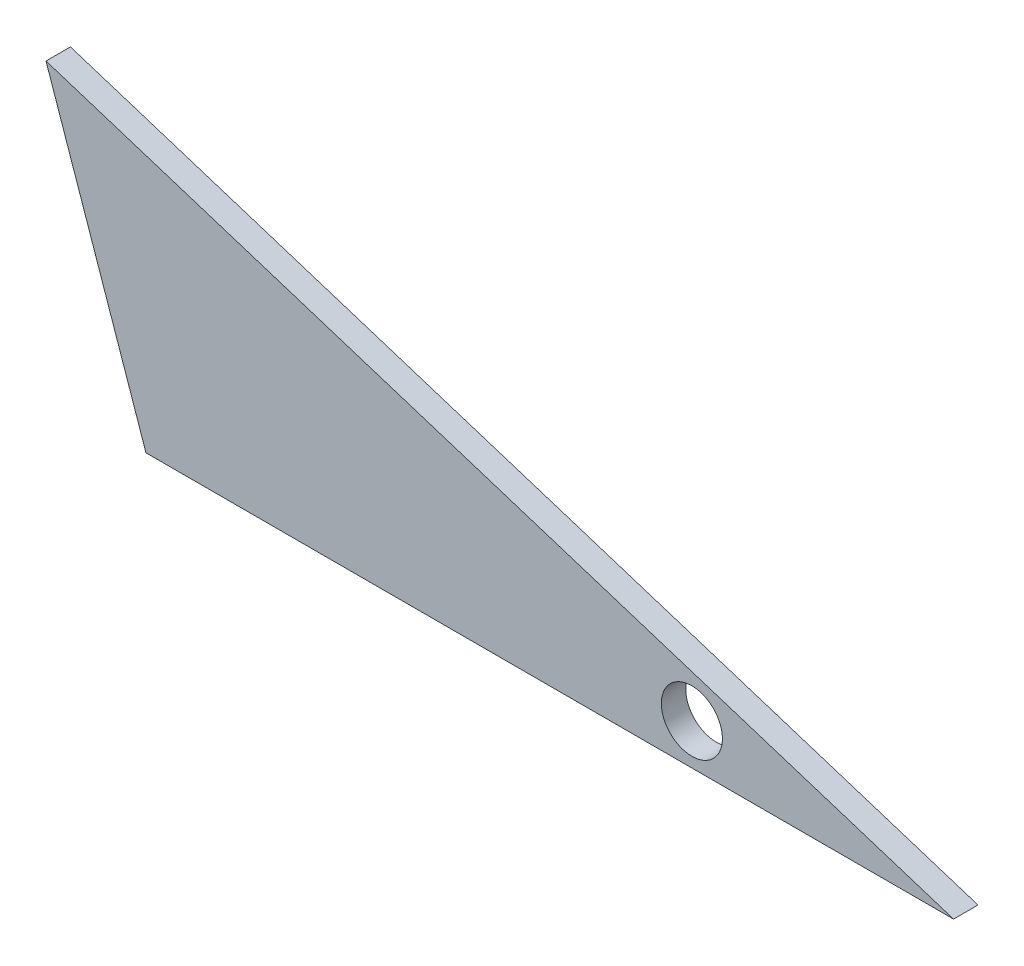
ISO-10303-21;
HEADER;
FILE_DESCRIPTION(('STEP AP214'),'2;1');
FILE_NAME('part.step','',(''),(''),'','','');
FILE_SCHEMA(('AUTOMOTIVE_DESIGN { 1 0 10303 214 1 1 1 1 }'));
ENDSEC;
DATA;
#1=APPLICATION_CONTEXT('core data for automotive mechanical design processes');
#2=APPLICATION_PROTOCOL_DEFINITION('international standard','automotive_design',2000,#1);
#3=PRODUCT_CONTEXT('',#1,'mechanical');
#4=PRODUCT('Part','Part','',(#3));
#5=PRODUCT_RELATED_PRODUCT_CATEGORY('part','',(#4));
#6=PRODUCT_DEFINITION_FORMATION('','',#4);
#7=PRODUCT_DEFINITION_CONTEXT('part definition',#1,'design');
#8=PRODUCT_DEFINITION('design','',#6,#7);
#9=PRODUCT_DEFINITION_SHAPE('','',#8);
#10=(LENGTH_UNIT() NAMED_UNIT(*) SI_UNIT(.MILLI.,.METRE.));
#11=(NAMED_UNIT(*) PLANE_ANGLE_UNIT() SI_UNIT($,.RADIAN.));
#12=(NAMED_UNIT(*) SI_UNIT($,.STERADIAN.) SOLID_ANGLE_UNIT());
#13=UNCERTAINTY_MEASURE_WITH_UNIT(LENGTH_MEASURE(1.E-05),#10,'distance_accuracy_value','');
#14=(GEOMETRIC_REPRESENTATION_CONTEXT(3) GLOBAL_UNCERTAINTY_ASSIGNED_CONTEXT((#13)) GLOBAL_UNIT_ASSIGNED_CONTEXT((#10,
#11,#12)) REPRESENTATION_CONTEXT('',''));
#15=CARTESIAN_POINT('',(0.,0.,0.));
#16=DIRECTION('',(0.,0.,1.));
#17=DIRECTION('',(1.,0.,0.));
#18=AXIS2_PLACEMENT_3D('',#15,#16,#17);
#19=CARTESIAN_POINT('',(0.,0.,3.81));
#20=DIRECTION('',(0.,0.,-1.));
#21=DIRECTION('',(-1.,0.,0.));
#22=AXIS2_PLACEMENT_3D('',#19,#20,#21);
#23=PLANE('',#22);
#24=DIRECTION('',(1.,0.,0.));
#25=VECTOR('',#24,1.);
#26=CARTESIAN_POINT('',(125.964112688173,0.,3.81));
#27=LINE('',#26,#25);
#28=CARTESIAN_POINT('',(0.,0.,3.81));
#29=VERTEX_POINT('',#28);
#30=CARTESIAN_POINT('',(125.964112688173,0.,3.81));
#31=VERTEX_POINT('',#30);
#32=EDGE_CURVE('E73',#29,#31,#27,.T.);
#33=ORIENTED_EDGE('',*,*,#32,.T.);
#34=DIRECTION('',(-0.952744871636842,0.303771640496111,0.));
#35=VECTOR('',#34,1.);
#36=CARTESIAN_POINT('',(-15.5938033701381,45.1340979798364,3.81));
#37=LINE('',#36,#35);
#38=CARTESIAN_POINT('',(-15.5938033701381,45.1340979798364,3.81));
#39=VERTEX_POINT('',#38);
#40=EDGE_CURVE('E69',#31,#39,#37,.T.);
#41=ORIENTED_EDGE('',*,*,#40,.T.);
#42=DIRECTION('',(0.326558120500464,-0.945177123049011,0.));
#43=VECTOR('',#42,1.);
#44=CARTESIAN_POINT('',(0.,0.,3.81));
#45=LINE('',#44,#43);
#46=EDGE_CURVE('E49',#39,#29,#45,.T.);
#47=ORIENTED_EDGE('',*,*,#46,.T.);
#48=EDGE_LOOP('',(#33,#41,#47));
#49=FACE_BOUND('',#48,.T.);
#50=CARTESIAN_POINT('',(85.1442062787306,6.34999999999999,3.81));
#51=DIRECTION('',(0.,0.,1.));
#52=DIRECTION('',(1.,0.,0.));
#53=AXIS2_PLACEMENT_3D('',#50,#51,#52);
#54=CIRCLE('',#53,4.7625);
#55=CARTESIAN_POINT('',(80.3817062787305,6.34999999999999,3.81));
#56=VERTEX_POINT('',#55);
#57=EDGE_CURVE('E83',#56,#56,#54,.T.);
#58=ORIENTED_EDGE('',*,*,#57,.F.);
#59=EDGE_LOOP('',(#58));
#60=FACE_BOUND('',#59,.T.);
#61=ADVANCED_FACE('F32',(#49,#60),#23,.F.);
#62=CARTESIAN_POINT('',(0.,0.,0.));
#63=DIRECTION('',(0.,0.,-1.));
#64=DIRECTION('',(-1.,0.,0.));
#65=AXIS2_PLACEMENT_3D('',#62,#63,#64);
#66=PLANE('',#65);
#67=DIRECTION('',(1.,0.,0.));
#68=VECTOR('',#67,1.);
#69=CARTESIAN_POINT('',(125.964112688173,0.,0.));
#70=LINE('',#69,#68);
#71=CARTESIAN_POINT('',(0.,0.,0.));
#72=VERTEX_POINT('',#71);
#73=CARTESIAN_POINT('',(125.964112688173,0.,0.));
#74=VERTEX_POINT('',#73);
#75=EDGE_CURVE('E80',#72,#74,#70,.T.);
#76=ORIENTED_EDGE('',*,*,#75,.F.);
#77=DIRECTION('',(0.326558120500464,-0.945177123049011,0.));
#78=VECTOR('',#77,1.);
#79=CARTESIAN_POINT('',(0.,0.,0.));
#80=LINE('',#79,#78);
#81=CARTESIAN_POINT('',(-15.5938033701381,45.1340979798364,0.));
#82=VERTEX_POINT('',#81);
#83=EDGE_CURVE('E66',#82,#72,#80,.T.);
#84=ORIENTED_EDGE('',*,*,#83,.F.);
#85=DIRECTION('',(-0.952744871636842,0.303771640496111,0.));
#86=VECTOR('',#85,1.);
#87=CARTESIAN_POINT('',(-15.5938033701381,45.1340979798364,0.));
#88=LINE('',#87,#86);
#89=EDGE_CURVE('E61',#74,#82,#88,.T.);
#90=ORIENTED_EDGE('',*,*,#89,.F.);
#91=EDGE_LOOP('',(#76,#84,#90));
#92=FACE_BOUND('',#91,.T.);
#93=CARTESIAN_POINT('',(85.1442062787306,6.34999999999999,0.));
#94=DIRECTION('',(0.,0.,1.));
#95=DIRECTION('',(1.,0.,0.));
#96=AXIS2_PLACEMENT_3D('',#93,#94,#95);
#97=CIRCLE('',#96,4.7625);
#98=CARTESIAN_POINT('',(80.3817062787305,6.34999999999999,0.));
#99=VERTEX_POINT('',#98);
#100=EDGE_CURVE('E87',#99,#99,#97,.T.);
#101=ORIENTED_EDGE('',*,*,#100,.T.);
#102=EDGE_LOOP('',(#101));
#103=FACE_BOUND('',#102,.T.);
#104=ADVANCED_FACE('F93',(#92,#103),#66,.T.);
#105=CARTESIAN_POINT('',(125.964112688173,0.,3.81));
#106=DIRECTION('',(0.,1.,0.));
#107=DIRECTION('',(-1.,0.,0.));
#108=AXIS2_PLACEMENT_3D('',#105,#106,#107);
#109=PLANE('',#108);
#110=ORIENTED_EDGE('',*,*,#75,.T.);
#111=DIRECTION('',(0.,0.,-1.));
#112=VECTOR('',#111,1.);
#113=CARTESIAN_POINT('',(125.964112688173,0.,3.81));
#114=LINE('',#113,#112);
#115=EDGE_CURVE('E11',#31,#74,#114,.T.);
#116=ORIENTED_EDGE('',*,*,#115,.F.);
#117=ORIENTED_EDGE('',*,*,#32,.F.);
#118=DIRECTION('',(0.,0.,-1.));
#119=VECTOR('',#118,1.);
#120=CARTESIAN_POINT('',(0.,0.,3.81));
#121=LINE('',#120,#119);
#122=EDGE_CURVE('E81',#29,#72,#121,.T.);
#123=ORIENTED_EDGE('',*,*,#122,.T.);
#124=EDGE_LOOP('',(#110,#116,#117,#123));
#125=FACE_BOUND('',#124,.T.);
#126=ADVANCED_FACE('F34',(#125),#109,.F.);
#127=CARTESIAN_POINT('',(-15.5938033701381,45.1340979798364,3.81));
#128=DIRECTION('',(-0.303771640496111,-0.952744871636842,0.));
#129=DIRECTION('',(0.952744871636842,-0.303771640496111,0.));
#130=AXIS2_PLACEMENT_3D('',#127,#128,#129);
#131=PLANE('',#130);
#132=ORIENTED_EDGE('',*,*,#89,.T.);
#133=DIRECTION('',(0.,0.,-1.));
#134=VECTOR('',#133,1.);
#135=CARTESIAN_POINT('',(-15.5938033701381,45.1340979798364,3.81));
#136=LINE('',#135,#134);
#137=EDGE_CURVE('E41',#39,#82,#136,.T.);
#138=ORIENTED_EDGE('',*,*,#137,.F.);
#139=ORIENTED_EDGE('',*,*,#40,.F.);
#140=ORIENTED_EDGE('',*,*,#115,.T.);
#141=EDGE_LOOP('',(#132,#138,#139,#140));
#142=FACE_BOUND('',#141,.T.);
#143=ADVANCED_FACE('F70',(#142),#131,.F.);
#144=CARTESIAN_POINT('',(0.,0.,3.81));
#145=DIRECTION('',(0.945177123049011,0.326558120500464,0.));
#146=DIRECTION('',(-0.326558120500464,0.945177123049011,0.));
#147=AXIS2_PLACEMENT_3D('',#144,#145,#146);
#148=PLANE('',#147);
#149=ORIENTED_EDGE('',*,*,#83,.T.);
#150=ORIENTED_EDGE('',*,*,#122,.F.);
#151=ORIENTED_EDGE('',*,*,#46,.F.);
#152=ORIENTED_EDGE('',*,*,#137,.T.);
#153=EDGE_LOOP('',(#149,#150,#151,#152));
#154=FACE_BOUND('',#153,.T.);
#155=ADVANCED_FACE('F92',(#154),#148,.F.);
#156=CARTESIAN_POINT('',(85.1442062787306,6.34999999999999,3.81));
#157=DIRECTION('',(0.,0.,-1.));
#158=DIRECTION('',(-1.,0.,0.));
#159=AXIS2_PLACEMENT_3D('',#156,#157,#158);
#160=CYLINDRICAL_SURFACE('',#159,4.7625);
#161=CARTESIAN_POINT('',(80.3817062787305,6.34999999999999,3.81));
#162=CARTESIAN_POINT('',(80.3817062787305,6.34999999999999,3.7703125));
#163=CARTESIAN_POINT('',(80.3817062787305,6.34999999999999,3.730625));
#164=CARTESIAN_POINT('',(80.3817062787305,6.34999999999999,3.65125));
#165=CARTESIAN_POINT('',(80.3817062787305,6.34999999999999,3.6115625));
#166=CARTESIAN_POINT('',(80.3817062787305,6.34999999999999,3.5321875));
#167=CARTESIAN_POINT('',(80.3817062787305,6.34999999999999,3.4925));
#168=CARTESIAN_POINT('',(80.3817062787305,6.34999999999999,3.413125));
#169=CARTESIAN_POINT('',(80.3817062787305,6.34999999999999,3.3734375));
#170=CARTESIAN_POINT('',(80.3817062787305,6.34999999999999,3.2940625));
#171=CARTESIAN_POINT('',(80.3817062787305,6.34999999999999,3.254375));
#172=CARTESIAN_POINT('',(80.3817062787305,6.34999999999999,3.175));
#173=CARTESIAN_POINT('',(80.3817062787305,6.34999999999999,3.1353125));
#174=CARTESIAN_POINT('',(80.3817062787305,6.34999999999999,3.0559375));
#175=CARTESIAN_POINT('',(80.3817062787305,6.34999999999999,3.01625));
#176=CARTESIAN_POINT('',(80.3817062787305,6.34999999999999,2.936875));
#177=CARTESIAN_POINT('',(80.3817062787305,6.34999999999999,2.8971875));
#178=CARTESIAN_POINT('',(80.3817062787305,6.34999999999999,2.8178125));
#179=CARTESIAN_POINT('',(80.3817062787305,6.34999999999999,2.778125));
#180=CARTESIAN_POINT('',(80.3817062787305,6.34999999999999,2.69875));
#181=CARTESIAN_POINT('',(80.3817062787305,6.34999999999999,2.6590625));
#182=CARTESIAN_POINT('',(80.3817062787305,6.34999999999999,2.5796875));
#183=CARTESIAN_POINT('',(80.3817062787305,6.34999999999999,2.54));
#184=CARTESIAN_POINT('',(80.3817062787305,6.34999999999999,2.460625));
#185=CARTESIAN_POINT('',(80.3817062787305,6.34999999999999,2.4209375));
#186=CARTESIAN_POINT('',(80.3817062787305,6.34999999999999,2.3415625));
#187=CARTESIAN_POINT('',(80.3817062787305,6.34999999999999,2.301875));
#188=CARTESIAN_POINT('',(80.3817062787305,6.34999999999999,2.2225));
#189=CARTESIAN_POINT('',(80.3817062787305,6.34999999999999,2.1828125));
#190=CARTESIAN_POINT('',(80.3817062787305,6.34999999999999,2.1034375));
#191=CARTESIAN_POINT('',(80.3817062787305,6.34999999999999,2.06375));
#192=CARTESIAN_POINT('',(80.3817062787305,6.34999999999999,1.984375));
#193=CARTESIAN_POINT('',(80.3817062787305,6.34999999999999,1.9446875));
#194=CARTESIAN_POINT('',(80.3817062787305,6.34999999999999,1.8653125));
#195=CARTESIAN_POINT('',(80.3817062787305,6.34999999999999,1.825625));
#196=CARTESIAN_POINT('',(80.3817062787305,6.34999999999999,1.74625));
#197=CARTESIAN_POINT('',(80.3817062787305,6.34999999999999,1.7065625));
#198=CARTESIAN_POINT('',(80.3817062787305,6.34999999999999,1.6271875));
#199=CARTESIAN_POINT('',(80.3817062787305,6.34999999999999,1.5875));
#200=CARTESIAN_POINT('',(80.3817062787305,6.34999999999999,1.508125));
#201=CARTESIAN_POINT('',(80.3817062787305,6.34999999999999,1.4684375));
#202=CARTESIAN_POINT('',(80.3817062787305,6.34999999999999,1.3890625));
#203=CARTESIAN_POINT('',(80.3817062787305,6.34999999999999,1.349375));
#204=CARTESIAN_POINT('',(80.3817062787305,6.34999999999999,1.27));
#205=CARTESIAN_POINT('',(80.3817062787305,6.34999999999999,1.2303125));
#206=CARTESIAN_POINT('',(80.3817062787305,6.34999999999999,1.1509375));
#207=CARTESIAN_POINT('',(80.3817062787305,6.34999999999999,1.11125));
#208=CARTESIAN_POINT('',(80.3817062787305,6.34999999999999,1.031875));
#209=CARTESIAN_POINT('',(80.3817062787305,6.34999999999999,0.9921875));
#210=CARTESIAN_POINT('',(80.3817062787305,6.34999999999999,0.9128125));
#211=CARTESIAN_POINT('',(80.3817062787305,6.34999999999999,0.873125));
#212=CARTESIAN_POINT('',(80.3817062787305,6.34999999999999,0.79375));
#213=CARTESIAN_POINT('',(80.3817062787305,6.34999999999999,0.7540625));
#214=CARTESIAN_POINT('',(80.3817062787305,6.34999999999999,0.6746875));
#215=CARTESIAN_POINT('',(80.3817062787305,6.34999999999999,0.635));
#216=CARTESIAN_POINT('',(80.3817062787305,6.34999999999999,0.555625));
#217=CARTESIAN_POINT('',(80.3817062787305,6.34999999999999,0.5159375));
#218=CARTESIAN_POINT('',(80.3817062787305,6.34999999999999,0.4365625));
#219=CARTESIAN_POINT('',(80.3817062787305,6.34999999999999,0.396875));
#220=CARTESIAN_POINT('',(80.3817062787305,6.34999999999999,0.3175));
#221=CARTESIAN_POINT('',(80.3817062787305,6.34999999999999,0.2778125));
#222=CARTESIAN_POINT('',(80.3817062787305,6.34999999999999,0.1984375));
#223=CARTESIAN_POINT('',(80.3817062787305,6.34999999999999,0.15875));
#224=CARTESIAN_POINT('',(80.3817062787305,6.34999999999999,0.0793749999999999));
#225=CARTESIAN_POINT('',(80.3817062787305,6.34999999999999,0.0396874999999999));
#226=CARTESIAN_POINT('',(80.3817062787305,6.34999999999999,0.));
#227=B_SPLINE_CURVE_WITH_KNOTS('',3,(#161,#162,#163,#164,#165,#166,#167,#168,#169,#170,#171,
#172,#173,#174,#175,#176,#177,#178,#179,#180,#181,#182,#183,#184,#185,#186,#187,#188,#189,#190,
#191,#192,#193,#194,#195,#196,#197,#198,#199,#200,#201,#202,#203,#204,#205,#206,#207,#208,#209,
#210,#211,#212,#213,#214,#215,#216,#217,#218,#219,#220,#221,#222,#223,#224,#225,#226),
.UNSPECIFIED.,.F.,.F.,(4,2,2,2,2,2,2,2,2,2,2,2,2,2,2,2,2,2,2,2,2,2,2,2,2,2,2,2,2,2,2,2,4),(0.,
0.1190625,0.238125,0.3571875,0.47625,0.595312499999999,0.714375,0.833437499999999,
0.952499999999999,1.0715625,1.190625,1.3096875,1.42875,1.5478125,1.666875,1.7859375,1.905,
2.0240625,2.143125,2.2621875,2.38125,2.5003125,2.619375,2.7384375,2.8575,2.9765625,3.095625,
3.2146875,3.33375,3.4528125,3.571875,3.6909375,3.81),.UNSPECIFIED.);
#228=EDGE_CURVE('BSEAM101',#56,#99,#227,.T.);
#229=ORIENTED_EDGE('',*,*,#57,.T.);
#230=ORIENTED_EDGE('',*,*,#100,.F.);
#231=ORIENTED_EDGE('',*,*,#228,.T.);
#232=ORIENTED_EDGE('',*,*,#228,.F.);
#233=EDGE_LOOP('',(#229,#231,#230,#232));
#234=FACE_BOUND('',#233,.T.);
#235=ADVANCED_FACE('F101',(#234),#160,.F.);
#236=CLOSED_SHELL('',(#61,#104,#126,#143,#155,#235));
#237=MANIFOLD_SOLID_BREP('B2',#236);
#238=ADVANCED_BREP_SHAPE_REPRESENTATION('',(#18,#237),#14);
#239=SHAPE_DEFINITION_REPRESENTATION(#9,#238);
ENDSEC;
END-ISO-10303-21;
